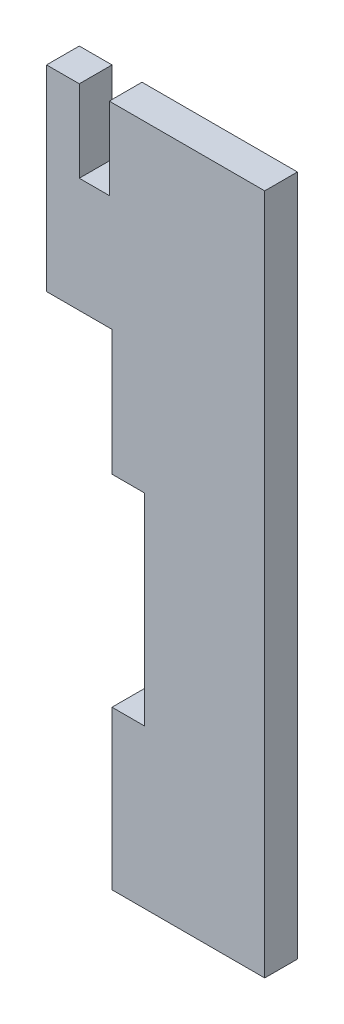
ISO-10303-21;
HEADER;
FILE_DESCRIPTION(('STEP AP214'),'2;1');
FILE_NAME('part.step','',(''),(''),'','','');
FILE_SCHEMA(('AUTOMOTIVE_DESIGN { 1 0 10303 214 1 1 1 1 }'));
ENDSEC;
DATA;
#1=APPLICATION_CONTEXT('core data for automotive mechanical design processes');
#2=APPLICATION_PROTOCOL_DEFINITION('international standard','automotive_design',2000,#1);
#3=PRODUCT_CONTEXT('',#1,'mechanical');
#4=PRODUCT('Part','Part','',(#3));
#5=PRODUCT_RELATED_PRODUCT_CATEGORY('part','',(#4));
#6=PRODUCT_DEFINITION_FORMATION('','',#4);
#7=PRODUCT_DEFINITION_CONTEXT('part definition',#1,'design');
#8=PRODUCT_DEFINITION('design','',#6,#7);
#9=PRODUCT_DEFINITION_SHAPE('','',#8);
#10=(LENGTH_UNIT() NAMED_UNIT(*) SI_UNIT(.MILLI.,.METRE.));
#11=(NAMED_UNIT(*) PLANE_ANGLE_UNIT() SI_UNIT($,.RADIAN.));
#12=(NAMED_UNIT(*) SI_UNIT($,.STERADIAN.) SOLID_ANGLE_UNIT());
#13=UNCERTAINTY_MEASURE_WITH_UNIT(LENGTH_MEASURE(1.E-05),#10,'distance_accuracy_value','');
#14=(GEOMETRIC_REPRESENTATION_CONTEXT(3) GLOBAL_UNCERTAINTY_ASSIGNED_CONTEXT((#13)) GLOBAL_UNIT_ASSIGNED_CONTEXT((#10,
#11,#12)) REPRESENTATION_CONTEXT('',''));
#15=CARTESIAN_POINT('',(0.,0.,0.));
#16=DIRECTION('',(0.,0.,1.));
#17=DIRECTION('',(1.,0.,0.));
#18=AXIS2_PLACEMENT_3D('',#15,#16,#17);
#19=CARTESIAN_POINT('',(12.,89.,0.));
#20=DIRECTION('',(1.,0.,0.));
#21=DIRECTION('',(0.,1.,0.));
#22=AXIS2_PLACEMENT_3D('',#19,#20,#21);
#23=PLANE('',#22);
#24=DIRECTION('',(0.,1.,0.));
#25=VECTOR('',#24,1.);
#26=CARTESIAN_POINT('',(12.,89.,0.));
#27=LINE('',#26,#25);
#28=CARTESIAN_POINT('',(12.,66.,0.));
#29=VERTEX_POINT('',#28);
#30=CARTESIAN_POINT('',(12.,89.,0.));
#31=VERTEX_POINT('',#30);
#32=EDGE_CURVE('E247',#29,#31,#27,.T.);
#33=ORIENTED_EDGE('',*,*,#32,.F.);
#34=DIRECTION('',(0.,0.,1.));
#35=VECTOR('',#34,1.);
#36=CARTESIAN_POINT('',(12.,66.,0.));
#37=LINE('',#36,#35);
#38=CARTESIAN_POINT('',(12.,66.,6.));
#39=VERTEX_POINT('',#38);
#40=EDGE_CURVE('E181',#29,#39,#37,.T.);
#41=ORIENTED_EDGE('',*,*,#40,.T.);
#42=DIRECTION('',(0.,1.,0.));
#43=VECTOR('',#42,1.);
#44=CARTESIAN_POINT('',(12.,89.,6.));
#45=LINE('',#44,#43);
#46=CARTESIAN_POINT('',(12.,89.,6.));
#47=VERTEX_POINT('',#46);
#48=EDGE_CURVE('E240',#39,#47,#45,.T.);
#49=ORIENTED_EDGE('',*,*,#48,.T.);
#50=DIRECTION('',(0.,0.,1.));
#51=VECTOR('',#50,1.);
#52=CARTESIAN_POINT('',(12.,89.,0.));
#53=LINE('',#52,#51);
#54=EDGE_CURVE('E226',#31,#47,#53,.T.);
#55=ORIENTED_EDGE('',*,*,#54,.F.);
#56=EDGE_LOOP('',(#33,#41,#49,#55));
#57=FACE_BOUND('',#56,.T.);
#58=ADVANCED_FACE('F43',(#57),#23,.F.);
#59=CARTESIAN_POINT('',(0.,125.,6.));
#60=DIRECTION('',(0.,-1.,0.));
#61=DIRECTION('',(0.,0.,-1.));
#62=AXIS2_PLACEMENT_3D('',#59,#60,#61);
#63=PLANE('',#62);
#64=DIRECTION('',(-1.,0.,0.));
#65=VECTOR('',#64,1.);
#66=CARTESIAN_POINT('',(0.,125.,6.));
#67=LINE('',#66,#65);
#68=CARTESIAN_POINT('',(6.,125.,6.));
#69=VERTEX_POINT('',#68);
#70=CARTESIAN_POINT('',(0.,125.,6.));
#71=VERTEX_POINT('',#70);
#72=EDGE_CURVE('E261',#69,#71,#67,.T.);
#73=ORIENTED_EDGE('',*,*,#72,.F.);
#74=DIRECTION('',(0.,0.,1.));
#75=VECTOR('',#74,1.);
#76=CARTESIAN_POINT('',(6.,125.,0.));
#77=LINE('',#76,#75);
#78=CARTESIAN_POINT('',(6.,125.,0.));
#79=VERTEX_POINT('',#78);
#80=EDGE_CURVE('E213',#79,#69,#77,.T.);
#81=ORIENTED_EDGE('',*,*,#80,.F.);
#82=DIRECTION('',(-1.,0.,0.));
#83=VECTOR('',#82,1.);
#84=CARTESIAN_POINT('',(0.,125.,0.));
#85=LINE('',#84,#83);
#86=CARTESIAN_POINT('',(0.,125.,0.));
#87=VERTEX_POINT('',#86);
#88=EDGE_CURVE('E276',#79,#87,#85,.T.);
#89=ORIENTED_EDGE('',*,*,#88,.T.);
#90=DIRECTION('',(0.,0.,-1.));
#91=VECTOR('',#90,1.);
#92=CARTESIAN_POINT('',(0.,125.,6.));
#93=LINE('',#92,#91);
#94=EDGE_CURVE('E266',#71,#87,#93,.T.);
#95=ORIENTED_EDGE('',*,*,#94,.F.);
#96=EDGE_LOOP('',(#73,#81,#89,#95));
#97=FACE_BOUND('',#96,.T.);
#98=ADVANCED_FACE('F329',(#97),#63,.F.);
#99=CARTESIAN_POINT('',(0.,0.,6.));
#100=DIRECTION('',(1.,0.,0.));
#101=DIRECTION('',(0.,0.,-1.));
#102=AXIS2_PLACEMENT_3D('',#99,#100,#101);
#103=PLANE('',#102);
#104=DIRECTION('',(0.,-1.,0.));
#105=VECTOR('',#104,1.);
#106=CARTESIAN_POINT('',(0.,0.,0.));
#107=LINE('',#106,#105);
#108=CARTESIAN_POINT('',(0.,89.,0.));
#109=VERTEX_POINT('',#108);
#110=EDGE_CURVE('E216',#87,#109,#107,.T.);
#111=ORIENTED_EDGE('',*,*,#110,.T.);
#112=DIRECTION('',(0.,0.,1.));
#113=VECTOR('',#112,1.);
#114=CARTESIAN_POINT('',(0.,89.,0.));
#115=LINE('',#114,#113);
#116=CARTESIAN_POINT('',(0.,89.,6.));
#117=VERTEX_POINT('',#116);
#118=EDGE_CURVE('E231',#109,#117,#115,.T.);
#119=ORIENTED_EDGE('',*,*,#118,.T.);
#120=DIRECTION('',(0.,-1.,0.));
#121=VECTOR('',#120,1.);
#122=CARTESIAN_POINT('',(0.,0.,6.));
#123=LINE('',#122,#121);
#124=EDGE_CURVE('E250',#71,#117,#123,.T.);
#125=ORIENTED_EDGE('',*,*,#124,.F.);
#126=ORIENTED_EDGE('',*,*,#94,.T.);
#127=EDGE_LOOP('',(#111,#119,#125,#126));
#128=FACE_BOUND('',#127,.T.);
#129=ADVANCED_FACE('F45',(#128),#103,.F.);
#130=CARTESIAN_POINT('',(0.,0.,6.));
#131=DIRECTION('',(0.,1.,0.));
#132=DIRECTION('',(0.,0.,1.));
#133=AXIS2_PLACEMENT_3D('',#130,#131,#132);
#134=PLANE('',#133);
#135=DIRECTION('',(1.,0.,0.));
#136=VECTOR('',#135,1.);
#137=CARTESIAN_POINT('',(0.,0.,6.));
#138=LINE('',#137,#136);
#139=CARTESIAN_POINT('',(12.,0.,6.));
#140=VERTEX_POINT('',#139);
#141=CARTESIAN_POINT('',(40.,0.,6.));
#142=VERTEX_POINT('',#141);
#143=EDGE_CURVE('E254',#140,#142,#138,.T.);
#144=ORIENTED_EDGE('',*,*,#143,.F.);
#145=DIRECTION('',(0.,0.,1.));
#146=VECTOR('',#145,1.);
#147=CARTESIAN_POINT('',(12.,0.,0.));
#148=LINE('',#147,#146);
#149=CARTESIAN_POINT('',(12.,0.,0.));
#150=VERTEX_POINT('',#149);
#151=EDGE_CURVE('E185',#150,#140,#148,.T.);
#152=ORIENTED_EDGE('',*,*,#151,.F.);
#153=DIRECTION('',(1.,0.,0.));
#154=VECTOR('',#153,1.);
#155=CARTESIAN_POINT('',(0.,0.,0.));
#156=LINE('',#155,#154);
#157=CARTESIAN_POINT('',(40.,0.,0.));
#158=VERTEX_POINT('',#157);
#159=EDGE_CURVE('E270',#150,#158,#156,.T.);
#160=ORIENTED_EDGE('',*,*,#159,.T.);
#161=DIRECTION('',(0.,0.,-1.));
#162=VECTOR('',#161,1.);
#163=CARTESIAN_POINT('',(40.,0.,6.));
#164=LINE('',#163,#162);
#165=EDGE_CURVE('E11',#142,#158,#164,.T.);
#166=ORIENTED_EDGE('',*,*,#165,.F.);
#167=EDGE_LOOP('',(#144,#152,#160,#166));
#168=FACE_BOUND('',#167,.T.);
#169=ADVANCED_FACE('F307',(#168),#134,.F.);
#170=CARTESIAN_POINT('',(40.,0.,6.));
#171=DIRECTION('',(-1.,0.,0.));
#172=DIRECTION('',(0.,-1.,0.));
#173=AXIS2_PLACEMENT_3D('',#170,#171,#172);
#174=PLANE('',#173);
#175=DIRECTION('',(0.,1.,0.));
#176=VECTOR('',#175,1.);
#177=CARTESIAN_POINT('',(40.,0.,0.));
#178=LINE('',#177,#176);
#179=CARTESIAN_POINT('',(40.,125.,0.));
#180=VERTEX_POINT('',#179);
#181=EDGE_CURVE('E273',#158,#180,#178,.T.);
#182=ORIENTED_EDGE('',*,*,#181,.T.);
#183=DIRECTION('',(0.,0.,-1.));
#184=VECTOR('',#183,1.);
#185=CARTESIAN_POINT('',(40.,125.,6.));
#186=LINE('',#185,#184);
#187=CARTESIAN_POINT('',(40.,125.,6.));
#188=VERTEX_POINT('',#187);
#189=EDGE_CURVE('E52',#188,#180,#186,.T.);
#190=ORIENTED_EDGE('',*,*,#189,.F.);
#191=DIRECTION('',(0.,1.,0.));
#192=VECTOR('',#191,1.);
#193=CARTESIAN_POINT('',(40.,0.,6.));
#194=LINE('',#193,#192);
#195=EDGE_CURVE('E258',#142,#188,#194,.T.);
#196=ORIENTED_EDGE('',*,*,#195,.F.);
#197=ORIENTED_EDGE('',*,*,#165,.T.);
#198=EDGE_LOOP('',(#182,#190,#196,#197));
#199=FACE_BOUND('',#198,.T.);
#200=ADVANCED_FACE('F305',(#199),#174,.F.);
#201=CARTESIAN_POINT('',(11.5,125.,0.));
#202=VERTEX_POINT('',#201);
#203=EDGE_CURVE('E255',#180,#202,#85,.T.);
#204=ORIENTED_EDGE('',*,*,#203,.T.);
#205=DIRECTION('',(0.,0.,1.));
#206=VECTOR('',#205,1.);
#207=CARTESIAN_POINT('',(11.5,125.,0.));
#208=LINE('',#207,#206);
#209=CARTESIAN_POINT('',(11.5,125.,6.));
#210=VERTEX_POINT('',#209);
#211=EDGE_CURVE('E217',#202,#210,#208,.T.);
#212=ORIENTED_EDGE('',*,*,#211,.T.);
#213=EDGE_CURVE('E262',#188,#210,#67,.T.);
#214=ORIENTED_EDGE('',*,*,#213,.F.);
#215=ORIENTED_EDGE('',*,*,#189,.T.);
#216=EDGE_LOOP('',(#204,#212,#214,#215));
#217=FACE_BOUND('',#216,.T.);
#218=ADVANCED_FACE('F288',(#217),#63,.F.);
#219=CARTESIAN_POINT('',(0.,0.,6.));
#220=DIRECTION('',(0.,0.,-1.));
#221=DIRECTION('',(-1.,0.,0.));
#222=AXIS2_PLACEMENT_3D('',#219,#220,#221);
#223=PLANE('',#222);
#224=ORIENTED_EDGE('',*,*,#48,.F.);
#225=DIRECTION('',(-1.,0.,0.));
#226=VECTOR('',#225,1.);
#227=CARTESIAN_POINT('',(12.,66.,6.));
#228=LINE('',#227,#226);
#229=CARTESIAN_POINT('',(18.,66.,6.));
#230=VERTEX_POINT('',#229);
#231=EDGE_CURVE('E169',#230,#39,#228,.T.);
#232=ORIENTED_EDGE('',*,*,#231,.F.);
#233=DIRECTION('',(0.,1.,0.));
#234=VECTOR('',#233,1.);
#235=CARTESIAN_POINT('',(18.,66.,6.));
#236=LINE('',#235,#234);
#237=CARTESIAN_POINT('',(18.,29.,6.));
#238=VERTEX_POINT('',#237);
#239=EDGE_CURVE('E172',#238,#230,#236,.T.);
#240=ORIENTED_EDGE('',*,*,#239,.F.);
#241=DIRECTION('',(1.,0.,0.));
#242=VECTOR('',#241,1.);
#243=CARTESIAN_POINT('',(12.,29.,6.));
#244=LINE('',#243,#242);
#245=CARTESIAN_POINT('',(12.,29.,6.));
#246=VERTEX_POINT('',#245);
#247=EDGE_CURVE('E147',#246,#238,#244,.T.);
#248=ORIENTED_EDGE('',*,*,#247,.F.);
#249=EDGE_CURVE('E207',#140,#246,#45,.T.);
#250=ORIENTED_EDGE('',*,*,#249,.F.);
#251=ORIENTED_EDGE('',*,*,#143,.T.);
#252=ORIENTED_EDGE('',*,*,#195,.T.);
#253=ORIENTED_EDGE('',*,*,#213,.T.);
#254=DIRECTION('',(0.,1.,0.));
#255=VECTOR('',#254,1.);
#256=CARTESIAN_POINT('',(11.5,125.,6.));
#257=LINE('',#256,#255);
#258=CARTESIAN_POINT('',(11.5,110.,6.));
#259=VERTEX_POINT('',#258);
#260=EDGE_CURVE('E195',#259,#210,#257,.T.);
#261=ORIENTED_EDGE('',*,*,#260,.F.);
#262=DIRECTION('',(1.,0.,0.));
#263=VECTOR('',#262,1.);
#264=CARTESIAN_POINT('',(6.,110.,6.));
#265=LINE('',#264,#263);
#266=CARTESIAN_POINT('',(6.,110.,6.));
#267=VERTEX_POINT('',#266);
#268=EDGE_CURVE('E206',#267,#259,#265,.T.);
#269=ORIENTED_EDGE('',*,*,#268,.F.);
#270=DIRECTION('',(0.,-1.,0.));
#271=VECTOR('',#270,1.);
#272=CARTESIAN_POINT('',(6.,125.,6.));
#273=LINE('',#272,#271);
#274=EDGE_CURVE('E202',#69,#267,#273,.T.);
#275=ORIENTED_EDGE('',*,*,#274,.F.);
#276=ORIENTED_EDGE('',*,*,#72,.T.);
#277=ORIENTED_EDGE('',*,*,#124,.T.);
#278=DIRECTION('',(-1.,0.,0.));
#279=VECTOR('',#278,1.);
#280=CARTESIAN_POINT('',(12.,89.,6.));
#281=LINE('',#280,#279);
#282=EDGE_CURVE('E237',#47,#117,#281,.T.);
#283=ORIENTED_EDGE('',*,*,#282,.F.);
#284=EDGE_LOOP('',(#224,#232,#240,#248,#250,#251,#252,#253,#261,#269,#275,#276,#277,#283));
#285=FACE_BOUND('',#284,.T.);
#286=ADVANCED_FACE('F301',(#285),#223,.F.);
#287=CARTESIAN_POINT('',(0.,0.,0.));
#288=DIRECTION('',(0.,0.,-1.));
#289=DIRECTION('',(-1.,0.,0.));
#290=AXIS2_PLACEMENT_3D('',#287,#288,#289);
#291=PLANE('',#290);
#292=DIRECTION('',(-1.,0.,0.));
#293=VECTOR('',#292,1.);
#294=CARTESIAN_POINT('',(12.,66.,0.));
#295=LINE('',#294,#293);
#296=CARTESIAN_POINT('',(18.,66.,0.));
#297=VERTEX_POINT('',#296);
#298=EDGE_CURVE('E162',#297,#29,#295,.T.);
#299=ORIENTED_EDGE('',*,*,#298,.T.);
#300=ORIENTED_EDGE('',*,*,#32,.T.);
#301=DIRECTION('',(-1.,0.,0.));
#302=VECTOR('',#301,1.);
#303=CARTESIAN_POINT('',(12.,89.,0.));
#304=LINE('',#303,#302);
#305=EDGE_CURVE('E230',#31,#109,#304,.T.);
#306=ORIENTED_EDGE('',*,*,#305,.T.);
#307=ORIENTED_EDGE('',*,*,#110,.F.);
#308=ORIENTED_EDGE('',*,*,#88,.F.);
#309=DIRECTION('',(0.,-1.,0.));
#310=VECTOR('',#309,1.);
#311=CARTESIAN_POINT('',(6.,125.,0.));
#312=LINE('',#311,#310);
#313=CARTESIAN_POINT('',(6.,110.,0.));
#314=VERTEX_POINT('',#313);
#315=EDGE_CURVE('E190',#79,#314,#312,.T.);
#316=ORIENTED_EDGE('',*,*,#315,.T.);
#317=DIRECTION('',(1.,0.,0.));
#318=VECTOR('',#317,1.);
#319=CARTESIAN_POINT('',(6.,110.,0.));
#320=LINE('',#319,#318);
#321=CARTESIAN_POINT('',(11.5,110.,0.));
#322=VERTEX_POINT('',#321);
#323=EDGE_CURVE('E194',#314,#322,#320,.T.);
#324=ORIENTED_EDGE('',*,*,#323,.T.);
#325=DIRECTION('',(0.,1.,0.));
#326=VECTOR('',#325,1.);
#327=CARTESIAN_POINT('',(11.5,125.,0.));
#328=LINE('',#327,#326);
#329=EDGE_CURVE('E67',#322,#202,#328,.T.);
#330=ORIENTED_EDGE('',*,*,#329,.T.);
#331=ORIENTED_EDGE('',*,*,#203,.F.);
#332=ORIENTED_EDGE('',*,*,#181,.F.);
#333=ORIENTED_EDGE('',*,*,#159,.F.);
#334=CARTESIAN_POINT('',(12.,29.,0.));
#335=VERTEX_POINT('',#334);
#336=EDGE_CURVE('E167',#150,#335,#27,.T.);
#337=ORIENTED_EDGE('',*,*,#336,.T.);
#338=DIRECTION('',(1.,0.,0.));
#339=VECTOR('',#338,1.);
#340=CARTESIAN_POINT('',(12.,29.,0.));
#341=LINE('',#340,#339);
#342=CARTESIAN_POINT('',(18.,29.,0.));
#343=VERTEX_POINT('',#342);
#344=EDGE_CURVE('E59',#335,#343,#341,.T.);
#345=ORIENTED_EDGE('',*,*,#344,.T.);
#346=DIRECTION('',(0.,1.,0.));
#347=VECTOR('',#346,1.);
#348=CARTESIAN_POINT('',(18.,66.,0.));
#349=LINE('',#348,#347);
#350=EDGE_CURVE('E156',#343,#297,#349,.T.);
#351=ORIENTED_EDGE('',*,*,#350,.T.);
#352=EDGE_LOOP('',(#299,#300,#306,#307,#308,#316,#324,#330,#331,#332,#333,#337,#345,#351));
#353=FACE_BOUND('',#352,.T.);
#354=ADVANCED_FACE('F165',(#353),#291,.T.);
#355=ORIENTED_EDGE('',*,*,#249,.T.);
#356=DIRECTION('',(0.,0.,1.));
#357=VECTOR('',#356,1.);
#358=CARTESIAN_POINT('',(12.,29.,0.));
#359=LINE('',#358,#357);
#360=EDGE_CURVE('E153',#335,#246,#359,.T.);
#361=ORIENTED_EDGE('',*,*,#360,.F.);
#362=ORIENTED_EDGE('',*,*,#336,.F.);
#363=ORIENTED_EDGE('',*,*,#151,.T.);
#364=EDGE_LOOP('',(#355,#361,#362,#363));
#365=FACE_BOUND('',#364,.T.);
#366=ADVANCED_FACE('F310',(#365),#23,.F.);
#367=CARTESIAN_POINT('',(12.,89.,0.));
#368=DIRECTION('',(0.,1.,0.));
#369=DIRECTION('',(0.,0.,1.));
#370=AXIS2_PLACEMENT_3D('',#367,#368,#369);
#371=PLANE('',#370);
#372=ORIENTED_EDGE('',*,*,#282,.T.);
#373=ORIENTED_EDGE('',*,*,#118,.F.);
#374=ORIENTED_EDGE('',*,*,#305,.F.);
#375=ORIENTED_EDGE('',*,*,#54,.T.);
#376=EDGE_LOOP('',(#372,#373,#374,#375));
#377=FACE_BOUND('',#376,.T.);
#378=ADVANCED_FACE('F333',(#377),#371,.F.);
#379=CARTESIAN_POINT('',(6.,125.,0.));
#380=DIRECTION('',(-1.,0.,0.));
#381=DIRECTION('',(0.,-1.,0.));
#382=AXIS2_PLACEMENT_3D('',#379,#380,#381);
#383=PLANE('',#382);
#384=ORIENTED_EDGE('',*,*,#274,.T.);
#385=DIRECTION('',(0.,0.,1.));
#386=VECTOR('',#385,1.);
#387=CARTESIAN_POINT('',(6.,110.,0.));
#388=LINE('',#387,#386);
#389=EDGE_CURVE('E201',#314,#267,#388,.T.);
#390=ORIENTED_EDGE('',*,*,#389,.F.);
#391=ORIENTED_EDGE('',*,*,#315,.F.);
#392=ORIENTED_EDGE('',*,*,#80,.T.);
#393=EDGE_LOOP('',(#384,#390,#391,#392));
#394=FACE_BOUND('',#393,.T.);
#395=ADVANCED_FACE('F335',(#394),#383,.F.);
#396=CARTESIAN_POINT('',(11.5,125.,0.));
#397=DIRECTION('',(1.,0.,0.));
#398=DIRECTION('',(0.,1.,0.));
#399=AXIS2_PLACEMENT_3D('',#396,#397,#398);
#400=PLANE('',#399);
#401=ORIENTED_EDGE('',*,*,#260,.T.);
#402=ORIENTED_EDGE('',*,*,#211,.F.);
#403=ORIENTED_EDGE('',*,*,#329,.F.);
#404=DIRECTION('',(0.,0.,1.));
#405=VECTOR('',#404,1.);
#406=CARTESIAN_POINT('',(11.5,110.,0.));
#407=LINE('',#406,#405);
#408=EDGE_CURVE('E221',#322,#259,#407,.T.);
#409=ORIENTED_EDGE('',*,*,#408,.T.);
#410=EDGE_LOOP('',(#401,#402,#403,#409));
#411=FACE_BOUND('',#410,.T.);
#412=ADVANCED_FACE('F298',(#411),#400,.F.);
#413=CARTESIAN_POINT('',(6.,110.,0.));
#414=DIRECTION('',(0.,-1.,0.));
#415=DIRECTION('',(0.,0.,-1.));
#416=AXIS2_PLACEMENT_3D('',#413,#414,#415);
#417=PLANE('',#416);
#418=ORIENTED_EDGE('',*,*,#268,.T.);
#419=ORIENTED_EDGE('',*,*,#408,.F.);
#420=ORIENTED_EDGE('',*,*,#323,.F.);
#421=ORIENTED_EDGE('',*,*,#389,.T.);
#422=EDGE_LOOP('',(#418,#419,#420,#421));
#423=FACE_BOUND('',#422,.T.);
#424=ADVANCED_FACE('F295',(#423),#417,.F.);
#425=CARTESIAN_POINT('',(12.,66.,0.));
#426=DIRECTION('',(0.,1.,0.));
#427=DIRECTION('',(0.,0.,1.));
#428=AXIS2_PLACEMENT_3D('',#425,#426,#427);
#429=PLANE('',#428);
#430=ORIENTED_EDGE('',*,*,#231,.T.);
#431=ORIENTED_EDGE('',*,*,#40,.F.);
#432=ORIENTED_EDGE('',*,*,#298,.F.);
#433=DIRECTION('',(0.,0.,1.));
#434=VECTOR('',#433,1.);
#435=CARTESIAN_POINT('',(18.,66.,0.));
#436=LINE('',#435,#434);
#437=EDGE_CURVE('E152',#297,#230,#436,.T.);
#438=ORIENTED_EDGE('',*,*,#437,.T.);
#439=EDGE_LOOP('',(#430,#431,#432,#438));
#440=FACE_BOUND('',#439,.T.);
#441=ADVANCED_FACE('F314',(#440),#429,.F.);
#442=CARTESIAN_POINT('',(18.,66.,0.));
#443=DIRECTION('',(1.,0.,0.));
#444=DIRECTION('',(0.,1.,0.));
#445=AXIS2_PLACEMENT_3D('',#442,#443,#444);
#446=PLANE('',#445);
#447=ORIENTED_EDGE('',*,*,#239,.T.);
#448=ORIENTED_EDGE('',*,*,#437,.F.);
#449=ORIENTED_EDGE('',*,*,#350,.F.);
#450=DIRECTION('',(0.,0.,1.));
#451=VECTOR('',#450,1.);
#452=CARTESIAN_POINT('',(18.,29.,0.));
#453=LINE('',#452,#451);
#454=EDGE_CURVE('E143',#343,#238,#453,.T.);
#455=ORIENTED_EDGE('',*,*,#454,.T.);
#456=EDGE_LOOP('',(#447,#448,#449,#455));
#457=FACE_BOUND('',#456,.T.);
#458=ADVANCED_FACE('F157',(#457),#446,.F.);
#459=CARTESIAN_POINT('',(12.,29.,0.));
#460=DIRECTION('',(0.,-1.,0.));
#461=DIRECTION('',(0.,0.,-1.));
#462=AXIS2_PLACEMENT_3D('',#459,#460,#461);
#463=PLANE('',#462);
#464=ORIENTED_EDGE('',*,*,#247,.T.);
#465=ORIENTED_EDGE('',*,*,#454,.F.);
#466=ORIENTED_EDGE('',*,*,#344,.F.);
#467=ORIENTED_EDGE('',*,*,#360,.T.);
#468=EDGE_LOOP('',(#464,#465,#466,#467));
#469=FACE_BOUND('',#468,.T.);
#470=ADVANCED_FACE('F145',(#469),#463,.F.);
#471=CLOSED_SHELL('',(#58,#98,#129,#169,#200,#218,#286,#354,#366,#378,#395,#412,#424,#441,#458,#470));
#472=MANIFOLD_SOLID_BREP('B2',#471);
#473=ADVANCED_BREP_SHAPE_REPRESENTATION('',(#18,#472),#14);
#474=SHAPE_DEFINITION_REPRESENTATION(#9,#473);
ENDSEC;
END-ISO-10303-21;
